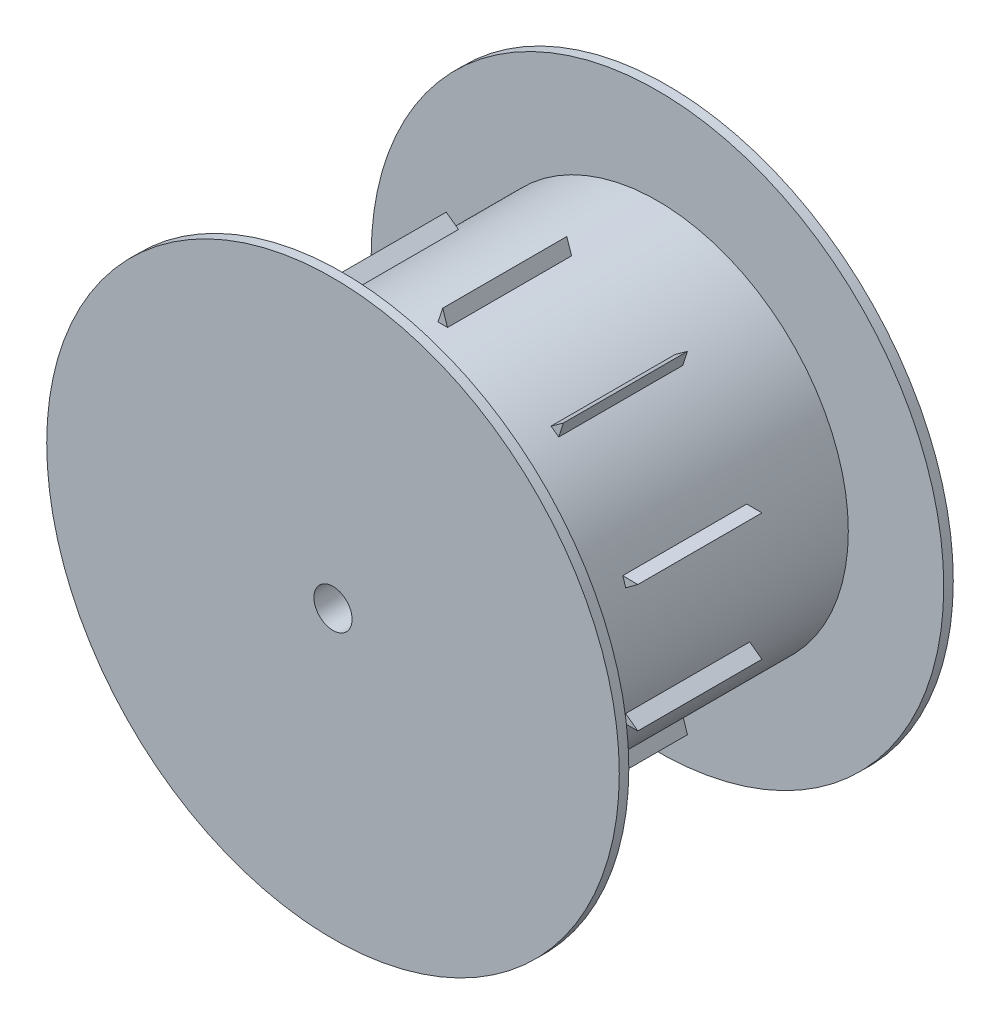
ISO-10303-21;
HEADER;
FILE_DESCRIPTION(('STEP AP214'),'2;1');
FILE_NAME('part.step','',(''),(''),'','','');
FILE_SCHEMA(('AUTOMOTIVE_DESIGN { 1 0 10303 214 1 1 1 1 }'));
ENDSEC;
DATA;
#1=APPLICATION_CONTEXT('core data for automotive mechanical design processes');
#2=APPLICATION_PROTOCOL_DEFINITION('international standard','automotive_design',2000,#1);
#3=PRODUCT_CONTEXT('',#1,'mechanical');
#4=PRODUCT('Part','Part','',(#3));
#5=PRODUCT_RELATED_PRODUCT_CATEGORY('part','',(#4));
#6=PRODUCT_DEFINITION_FORMATION('','',#4);
#7=PRODUCT_DEFINITION_CONTEXT('part definition',#1,'design');
#8=PRODUCT_DEFINITION('design','',#6,#7);
#9=PRODUCT_DEFINITION_SHAPE('','',#8);
#10=(LENGTH_UNIT() NAMED_UNIT(*) SI_UNIT(.MILLI.,.METRE.));
#11=(NAMED_UNIT(*) PLANE_ANGLE_UNIT() SI_UNIT($,.RADIAN.));
#12=(NAMED_UNIT(*) SI_UNIT($,.STERADIAN.) SOLID_ANGLE_UNIT());
#13=UNCERTAINTY_MEASURE_WITH_UNIT(LENGTH_MEASURE(1.E-05),#10,'distance_accuracy_value','');
#14=(GEOMETRIC_REPRESENTATION_CONTEXT(3) GLOBAL_UNCERTAINTY_ASSIGNED_CONTEXT((#13)) GLOBAL_UNIT_ASSIGNED_CONTEXT((#10,
#11,#12)) REPRESENTATION_CONTEXT('',''));
#15=CARTESIAN_POINT('',(0.,0.,0.));
#16=DIRECTION('',(0.,0.,1.));
#17=DIRECTION('',(1.,0.,0.));
#18=AXIS2_PLACEMENT_3D('',#15,#16,#17);
#19=CARTESIAN_POINT('',(-12.2328744271007,17.6877580052076,10.5));
#20=DIRECTION('',(0.,0.,1.));
#21=DIRECTION('',(1.,0.,0.));
#22=AXIS2_PLACEMENT_3D('',#19,#20,#21);
#23=PLANE('',#22);
#24=DIRECTION('',(-0.30297563116742,-0.952998303733382,0.));
#25=VECTOR('',#24,1.);
#26=CARTESIAN_POINT('',(6.45512176317895,-2.05220154411612,10.5));
#27=LINE('',#26,#25);
#28=CARTESIAN_POINT('',(12.6373829242879,17.3938653790615,10.5));
#29=VERTEX_POINT('',#28);
#30=CARTESIAN_POINT('',(12.1565393110214,15.8813901148354,10.5));
#31=VERTEX_POINT('',#30);
#32=EDGE_CURVE('E365',#29,#31,#27,.T.);
#33=ORIENTED_EDGE('',*,*,#32,.T.);
#34=CARTESIAN_POINT('',(0.,0.,10.5));
#35=DIRECTION('',(0.,0.,1.));
#36=DIRECTION('',(1.,0.,0.));
#37=AXIS2_PLACEMENT_3D('',#34,#35,#36);
#38=CIRCLE('',#37,20.);
#39=CARTESIAN_POINT('',(11.3475223166465,16.4691753671278,10.5));
#40=VERTEX_POINT('',#39);
#41=EDGE_CURVE('E590',#31,#40,#38,.T.);
#42=ORIENTED_EDGE('',*,*,#41,.T.);
#43=DIRECTION('',(0.812730627871636,0.582639619764548,0.));
#44=VECTOR('',#43,1.);
#45=CARTESIAN_POINT('',(-3.94650197686461,5.50502046333546,10.5));
#46=LINE('',#45,#44);
#47=EDGE_CURVE('E370',#40,#29,#46,.T.);
#48=ORIENTED_EDGE('',*,*,#47,.T.);
#49=EDGE_LOOP('',(#33,#42,#48));
#50=FACE_BOUND('',#49,.T.);
#51=ADVANCED_FACE('F163',(#50),#23,.F.);
#52=CARTESIAN_POINT('',(-12.2328744271007,17.6877580052076,23.5));
#53=DIRECTION('',(0.,0.,1.));
#54=DIRECTION('',(1.,0.,0.));
#55=AXIS2_PLACEMENT_3D('',#52,#53,#54);
#56=PLANE('',#55);
#57=CARTESIAN_POINT('',(0.,0.,23.5));
#58=DIRECTION('',(0.,0.,1.));
#59=DIRECTION('',(1.,0.,0.));
#60=AXIS2_PLACEMENT_3D('',#57,#58,#59);
#61=CIRCLE('',#60,20.);
#62=CARTESIAN_POINT('',(12.1565393110214,15.8813901148354,23.5));
#63=VERTEX_POINT('',#62);
#64=CARTESIAN_POINT('',(11.3475223166466,16.4691753671278,23.5));
#65=VERTEX_POINT('',#64);
#66=EDGE_CURVE('E377',#63,#65,#61,.T.);
#67=ORIENTED_EDGE('',*,*,#66,.F.);
#68=DIRECTION('',(0.30297563116742,0.952998303733382,0.));
#69=VECTOR('',#68,1.);
#70=CARTESIAN_POINT('',(6.45512176317895,-2.05220154411612,23.5));
#71=LINE('',#70,#69);
#72=CARTESIAN_POINT('',(12.6373829242879,17.3938653790615,23.5));
#73=VERTEX_POINT('',#72);
#74=EDGE_CURVE('E362',#63,#73,#71,.T.);
#75=ORIENTED_EDGE('',*,*,#74,.T.);
#76=DIRECTION('',(-0.812730627871636,-0.582639619764548,0.));
#77=VECTOR('',#76,1.);
#78=CARTESIAN_POINT('',(-3.94650197686461,5.50502046333546,23.5));
#79=LINE('',#78,#77);
#80=EDGE_CURVE('E369',#73,#65,#79,.T.);
#81=ORIENTED_EDGE('',*,*,#80,.T.);
#82=EDGE_LOOP('',(#67,#75,#81));
#83=FACE_BOUND('',#82,.T.);
#84=ADVANCED_FACE('F375',(#83),#56,.T.);
#85=DIRECTION('',(0.99997986569607,-0.00634572316367438,0.));
#86=VECTOR('',#85,1.);
#87=CARTESIAN_POINT('',(0.0429826742990749,6.77335076936435,10.5));
#88=LINE('',#87,#86);
#89=CARTESIAN_POINT('',(18.8606767964322,6.65393648756314,10.5));
#90=VERTEX_POINT('',#89);
#91=CARTESIAN_POINT('',(20.4477151003457,6.6438653790616,10.5));
#92=VERTEX_POINT('',#91);
#93=EDGE_CURVE('E378',#90,#92,#88,.T.);
#94=ORIENTED_EDGE('',*,*,#93,.T.);
#95=DIRECTION('',(-0.805270782890145,-0.59290721552659,0.));
#96=VECTOR('',#95,1.);
#97=CARTESIAN_POINT('',(4.01604940480804,-5.45449129922123,10.5));
#98=LINE('',#97,#96);
#99=CARTESIAN_POINT('',(19.1696937908072,5.70287997126799,10.5));
#100=VERTEX_POINT('',#99);
#101=EDGE_CURVE('E383',#92,#100,#98,.T.);
#102=ORIENTED_EDGE('',*,*,#101,.T.);
#103=EDGE_CURVE('E449',#100,#90,#38,.T.);
#104=ORIENTED_EDGE('',*,*,#103,.T.);
#105=EDGE_LOOP('',(#94,#102,#104));
#106=FACE_BOUND('',#105,.T.);
#107=ADVANCED_FACE('F666',(#106),#23,.F.);
#108=DIRECTION('',(0.805270782890145,0.59290721552659,0.));
#109=VECTOR('',#108,1.);
#110=CARTESIAN_POINT('',(4.01604940480804,-5.45449129922123,23.5));
#111=LINE('',#110,#109);
#112=CARTESIAN_POINT('',(19.1696937908072,5.70287997126799,23.5));
#113=VERTEX_POINT('',#112);
#114=CARTESIAN_POINT('',(20.4477151003457,6.6438653790616,23.5));
#115=VERTEX_POINT('',#114);
#116=EDGE_CURVE('E386',#113,#115,#111,.T.);
#117=ORIENTED_EDGE('',*,*,#116,.T.);
#118=DIRECTION('',(-0.99997986569607,0.00634572316367438,0.));
#119=VECTOR('',#118,1.);
#120=CARTESIAN_POINT('',(0.0429826742990749,6.77335076936435,23.5));
#121=LINE('',#120,#119);
#122=CARTESIAN_POINT('',(18.8606767964322,6.65393648756314,23.5));
#123=VERTEX_POINT('',#122);
#124=EDGE_CURVE('E178',#115,#123,#121,.T.);
#125=ORIENTED_EDGE('',*,*,#124,.T.);
#126=EDGE_CURVE('E454',#113,#123,#61,.T.);
#127=ORIENTED_EDGE('',*,*,#126,.F.);
#128=EDGE_LOOP('',(#117,#125,#127));
#129=FACE_BOUND('',#128,.T.);
#130=ADVANCED_FACE('F577',(#129),#56,.T.);
#131=DIRECTION('',(-0.99997986569607,-0.00634572316369786,0.));
#132=VECTOR('',#131,1.);
#133=CARTESIAN_POINT('',(0.0429826742992345,-6.7733507693644,10.5));
#134=LINE('',#133,#132);
#135=CARTESIAN_POINT('',(20.4477151003459,-6.64386537906117,10.5));
#136=VERTEX_POINT('',#135);
#137=CARTESIAN_POINT('',(18.8606767964323,-6.65393648756275,10.5));
#138=VERTEX_POINT('',#137);
#139=EDGE_CURVE('E718',#136,#138,#134,.T.);
#140=ORIENTED_EDGE('',*,*,#139,.T.);
#141=CARTESIAN_POINT('',(19.1696937908073,-5.7028799712676,10.5));
#142=VERTEX_POINT('',#141);
#143=EDGE_CURVE('E445',#138,#142,#38,.T.);
#144=ORIENTED_EDGE('',*,*,#143,.T.);
#145=DIRECTION('',(0.805270782890159,-0.592907215526571,0.));
#146=VECTOR('',#145,1.);
#147=CARTESIAN_POINT('',(4.01604940480788,5.45449129922129,10.5));
#148=LINE('',#147,#146);
#149=EDGE_CURVE('E438',#142,#136,#148,.T.);
#150=ORIENTED_EDGE('',*,*,#149,.T.);
#151=EDGE_LOOP('',(#140,#144,#150));
#152=FACE_BOUND('',#151,.T.);
#153=ADVANCED_FACE('F674',(#152),#23,.F.);
#154=CARTESIAN_POINT('',(18.8606767964323,-6.65393648756275,23.5));
#155=VERTEX_POINT('',#154);
#156=CARTESIAN_POINT('',(19.1696937908073,-5.7028799712676,23.5));
#157=VERTEX_POINT('',#156);
#158=EDGE_CURVE('E450',#155,#157,#61,.T.);
#159=ORIENTED_EDGE('',*,*,#158,.F.);
#160=DIRECTION('',(0.99997986569607,0.00634572316369786,0.));
#161=VECTOR('',#160,1.);
#162=CARTESIAN_POINT('',(0.0429826742992345,-6.7733507693644,23.5));
#163=LINE('',#162,#161);
#164=CARTESIAN_POINT('',(20.4477151003459,-6.64386537906117,23.5));
#165=VERTEX_POINT('',#164);
#166=EDGE_CURVE('E635',#155,#165,#163,.T.);
#167=ORIENTED_EDGE('',*,*,#166,.T.);
#168=DIRECTION('',(-0.805270782890159,0.592907215526571,0.));
#169=VECTOR('',#168,1.);
#170=CARTESIAN_POINT('',(4.01604940480788,5.45449129922129,23.5));
#171=LINE('',#170,#169);
#172=EDGE_CURVE('E434',#165,#157,#171,.T.);
#173=ORIENTED_EDGE('',*,*,#172,.T.);
#174=EDGE_LOOP('',(#159,#167,#173));
#175=FACE_BOUND('',#174,.T.);
#176=ADVANCED_FACE('F706',(#175),#56,.T.);
#177=DIRECTION('',(0.302975631167443,-0.952998303733375,0.));
#178=VECTOR('',#177,1.);
#179=CARTESIAN_POINT('',(6.45512176317885,2.05220154411626,10.5));
#180=LINE('',#179,#178);
#181=CARTESIAN_POINT('',(12.1565393110218,-15.8813901148351,10.5));
#182=VERTEX_POINT('',#181);
#183=CARTESIAN_POINT('',(12.6373829242883,-17.3938653790613,10.5));
#184=VERTEX_POINT('',#183);
#185=EDGE_CURVE('E617',#182,#184,#180,.T.);
#186=ORIENTED_EDGE('',*,*,#185,.T.);
#187=DIRECTION('',(-0.81273062787165,0.582639619764528,0.));
#188=VECTOR('',#187,1.);
#189=CARTESIAN_POINT('',(-3.94650197686451,-5.5050204633356,10.5));
#190=LINE('',#189,#188);
#191=CARTESIAN_POINT('',(11.3475223166468,-16.4691753671276,10.5));
#192=VERTEX_POINT('',#191);
#193=EDGE_CURVE('E431',#184,#192,#190,.T.);
#194=ORIENTED_EDGE('',*,*,#193,.T.);
#195=EDGE_CURVE('E448',#192,#182,#38,.T.);
#196=ORIENTED_EDGE('',*,*,#195,.T.);
#197=EDGE_LOOP('',(#186,#194,#196));
#198=FACE_BOUND('',#197,.T.);
#199=ADVANCED_FACE('F616',(#198),#23,.F.);
#200=DIRECTION('',(0.81273062787165,-0.582639619764528,0.));
#201=VECTOR('',#200,1.);
#202=CARTESIAN_POINT('',(-3.94650197686451,-5.5050204633356,23.5));
#203=LINE('',#202,#201);
#204=CARTESIAN_POINT('',(11.3475223166468,-16.4691753671276,23.5));
#205=VERTEX_POINT('',#204);
#206=CARTESIAN_POINT('',(12.6373829242883,-17.3938653790613,23.5));
#207=VERTEX_POINT('',#206);
#208=EDGE_CURVE('E427',#205,#207,#203,.T.);
#209=ORIENTED_EDGE('',*,*,#208,.T.);
#210=DIRECTION('',(-0.302975631167443,0.952998303733375,0.));
#211=VECTOR('',#210,1.);
#212=CARTESIAN_POINT('',(6.45512176317885,2.05220154411626,23.5));
#213=LINE('',#212,#211);
#214=CARTESIAN_POINT('',(12.1565393110218,-15.8813901148351,23.5));
#215=VERTEX_POINT('',#214);
#216=EDGE_CURVE('E186',#207,#215,#213,.T.);
#217=ORIENTED_EDGE('',*,*,#216,.T.);
#218=EDGE_CURVE('E453',#205,#215,#61,.T.);
#219=ORIENTED_EDGE('',*,*,#218,.F.);
#220=EDGE_LOOP('',(#209,#217,#219));
#221=FACE_BOUND('',#220,.T.);
#222=ADVANCED_FACE('F626',(#221),#56,.T.);
#223=DIRECTION('',(-0.315045913898294,0.949076431135021,0.));
#224=VECTOR('',#223,1.);
#225=CARTESIAN_POINT('',(-6.42855700953468,-2.13395944907624,10.5));
#226=LINE('',#225,#224);
#227=CARTESIAN_POINT('',(0.,-21.5,10.5));
#228=VERTEX_POINT('',#227);
#229=CARTESIAN_POINT('',(-0.500000000000002,-19.9937490231322,10.5));
#230=VERTEX_POINT('',#229);
#231=EDGE_CURVE('E627',#228,#230,#226,.T.);
#232=ORIENTED_EDGE('',*,*,#231,.T.);
#233=CARTESIAN_POINT('',(0.499999999999998,-19.9937490231322,10.5));
#234=VERTEX_POINT('',#233);
#235=EDGE_CURVE('E604',#230,#234,#38,.T.);
#236=ORIENTED_EDGE('',*,*,#235,.T.);
#237=DIRECTION('',(-0.315045913898292,-0.949076431135022,0.));
#238=VECTOR('',#237,1.);
#239=CARTESIAN_POINT('',(6.42855700953463,-2.13395944907621,10.5));
#240=LINE('',#239,#238);
#241=EDGE_CURVE('E424',#234,#228,#240,.T.);
#242=ORIENTED_EDGE('',*,*,#241,.T.);
#243=EDGE_LOOP('',(#232,#236,#242));
#244=FACE_BOUND('',#243,.T.);
#245=ADVANCED_FACE('F697',(#244),#23,.F.);
#246=CARTESIAN_POINT('',(-0.500000000000002,-19.9937490231322,23.5));
#247=VERTEX_POINT('',#246);
#248=CARTESIAN_POINT('',(0.499999999999998,-19.9937490231322,23.5));
#249=VERTEX_POINT('',#248);
#250=EDGE_CURVE('E738',#247,#249,#61,.T.);
#251=ORIENTED_EDGE('',*,*,#250,.F.);
#252=DIRECTION('',(0.315045913898294,-0.949076431135021,0.));
#253=VECTOR('',#252,1.);
#254=CARTESIAN_POINT('',(-6.42855700953468,-2.13395944907624,23.5));
#255=LINE('',#254,#253);
#256=CARTESIAN_POINT('',(0.,-21.5,23.5));
#257=VERTEX_POINT('',#256);
#258=EDGE_CURVE('E630',#247,#257,#255,.T.);
#259=ORIENTED_EDGE('',*,*,#258,.T.);
#260=DIRECTION('',(0.315045913898292,0.949076431135022,0.));
#261=VECTOR('',#260,1.);
#262=CARTESIAN_POINT('',(6.42855700953463,-2.13395944907621,23.5));
#263=LINE('',#262,#261);
#264=EDGE_CURVE('E420',#257,#249,#263,.T.);
#265=ORIENTED_EDGE('',*,*,#264,.T.);
#266=EDGE_LOOP('',(#251,#259,#265));
#267=FACE_BOUND('',#266,.T.);
#268=ADVANCED_FACE('F695',(#267),#56,.T.);
#269=DIRECTION('',(-0.81273062787164,-0.582639619764542,0.));
#270=VECTOR('',#269,1.);
#271=CARTESIAN_POINT('',(3.94650197686457,-5.50502046333549,10.5));
#272=LINE('',#271,#270);
#273=CARTESIAN_POINT('',(-11.3475223166466,-16.4691753671278,10.5));
#274=VERTEX_POINT('',#273);
#275=CARTESIAN_POINT('',(-12.6373829242881,-17.3938653790614,10.5));
#276=VERTEX_POINT('',#275);
#277=EDGE_CURVE('E642',#274,#276,#272,.T.);
#278=ORIENTED_EDGE('',*,*,#277,.T.);
#279=DIRECTION('',(0.302975631167427,0.95299830373338,0.));
#280=VECTOR('',#279,1.);
#281=CARTESIAN_POINT('',(-6.45512176317894,2.05220154411617,10.5));
#282=LINE('',#281,#280);
#283=CARTESIAN_POINT('',(-12.1565393110215,-15.8813901148353,10.5));
#284=VERTEX_POINT('',#283);
#285=EDGE_CURVE('E417',#276,#284,#282,.T.);
#286=ORIENTED_EDGE('',*,*,#285,.T.);
#287=EDGE_CURVE('E599',#284,#274,#38,.T.);
#288=ORIENTED_EDGE('',*,*,#287,.T.);
#289=EDGE_LOOP('',(#278,#286,#288));
#290=FACE_BOUND('',#289,.T.);
#291=ADVANCED_FACE('F690',(#290),#23,.F.);
#292=DIRECTION('',(-0.302975631167427,-0.95299830373338,0.));
#293=VECTOR('',#292,1.);
#294=CARTESIAN_POINT('',(-6.45512176317894,2.05220154411617,23.5));
#295=LINE('',#294,#293);
#296=CARTESIAN_POINT('',(-12.1565393110215,-15.8813901148353,23.5));
#297=VERTEX_POINT('',#296);
#298=CARTESIAN_POINT('',(-12.6373829242881,-17.3938653790614,23.5));
#299=VERTEX_POINT('',#298);
#300=EDGE_CURVE('E413',#297,#299,#295,.T.);
#301=ORIENTED_EDGE('',*,*,#300,.T.);
#302=DIRECTION('',(0.81273062787164,0.582639619764542,0.));
#303=VECTOR('',#302,1.);
#304=CARTESIAN_POINT('',(3.94650197686457,-5.50502046333549,23.5));
#305=LINE('',#304,#303);
#306=CARTESIAN_POINT('',(-11.3475223166466,-16.4691753671278,23.5));
#307=VERTEX_POINT('',#306);
#308=EDGE_CURVE('E638',#299,#307,#305,.T.);
#309=ORIENTED_EDGE('',*,*,#308,.T.);
#310=EDGE_CURVE('E745',#297,#307,#61,.T.);
#311=ORIENTED_EDGE('',*,*,#310,.F.);
#312=EDGE_LOOP('',(#301,#309,#311));
#313=FACE_BOUND('',#312,.T.);
#314=ADVANCED_FACE('F688',(#313),#56,.T.);
#315=DIRECTION('',(0.805270782890149,0.592907215526584,0.));
#316=VECTOR('',#315,1.);
#317=CARTESIAN_POINT('',(-4.01604940480801,5.45449129922126,10.5));
#318=LINE('',#317,#316);
#319=CARTESIAN_POINT('',(-20.4477151003458,-6.64386537906146,10.5));
#320=VERTEX_POINT('',#319);
#321=CARTESIAN_POINT('',(-19.1696937908072,-5.70287997126786,10.5));
#322=VERTEX_POINT('',#321);
#323=EDGE_CURVE('E570',#320,#322,#318,.T.);
#324=ORIENTED_EDGE('',*,*,#323,.T.);
#325=CARTESIAN_POINT('',(-18.8606767964322,-6.65393648756301,10.5));
#326=VERTEX_POINT('',#325);
#327=EDGE_CURVE('E597',#322,#326,#38,.T.);
#328=ORIENTED_EDGE('',*,*,#327,.T.);
#329=DIRECTION('',(-0.99997986569607,0.00634572316368137,0.));
#330=VECTOR('',#329,1.);
#331=CARTESIAN_POINT('',(-0.0429826742991226,-6.77335076936435,10.5));
#332=LINE('',#331,#330);
#333=EDGE_CURVE('E410',#326,#320,#332,.T.);
#334=ORIENTED_EDGE('',*,*,#333,.T.);
#335=EDGE_LOOP('',(#324,#328,#334));
#336=FACE_BOUND('',#335,.T.);
#337=ADVANCED_FACE('F682',(#336),#23,.F.);
#338=CARTESIAN_POINT('',(-19.1696937908072,-5.70287997126786,23.5));
#339=VERTEX_POINT('',#338);
#340=CARTESIAN_POINT('',(-18.8606767964322,-6.65393648756301,23.5));
#341=VERTEX_POINT('',#340);
#342=EDGE_CURVE('E747',#339,#341,#61,.T.);
#343=ORIENTED_EDGE('',*,*,#342,.F.);
#344=DIRECTION('',(-0.805270782890149,-0.592907215526584,0.));
#345=VECTOR('',#344,1.);
#346=CARTESIAN_POINT('',(-4.01604940480801,5.45449129922126,23.5));
#347=LINE('',#346,#345);
#348=CARTESIAN_POINT('',(-20.4477151003458,-6.64386537906146,23.5));
#349=VERTEX_POINT('',#348);
#350=EDGE_CURVE('E565',#339,#349,#347,.T.);
#351=ORIENTED_EDGE('',*,*,#350,.T.);
#352=DIRECTION('',(0.99997986569607,-0.00634572316368137,0.));
#353=VECTOR('',#352,1.);
#354=CARTESIAN_POINT('',(-0.0429826742991226,-6.77335076936435,23.5));
#355=LINE('',#354,#353);
#356=EDGE_CURVE('E406',#349,#341,#355,.T.);
#357=ORIENTED_EDGE('',*,*,#356,.T.);
#358=EDGE_LOOP('',(#343,#351,#357));
#359=FACE_BOUND('',#358,.T.);
#360=ADVANCED_FACE('F681',(#359),#56,.T.);
#361=DIRECTION('',(-0.805270782890154,0.592907215526576,0.));
#362=VECTOR('',#361,1.);
#363=CARTESIAN_POINT('',(-4.01604940480792,-5.45449129922126,10.5));
#364=LINE('',#363,#362);
#365=CARTESIAN_POINT('',(-19.1696937908072,5.70287997126773,10.5));
#366=VERTEX_POINT('',#365);
#367=CARTESIAN_POINT('',(-20.4477151003458,6.64386537906131,10.5));
#368=VERTEX_POINT('',#367);
#369=EDGE_CURVE('E562',#366,#368,#364,.T.);
#370=ORIENTED_EDGE('',*,*,#369,.T.);
#371=DIRECTION('',(0.99997986569607,0.00634572316369114,0.));
#372=VECTOR('',#371,1.);
#373=CARTESIAN_POINT('',(-0.042982674299189,6.7733507693644,10.5));
#374=LINE('',#373,#372);
#375=CARTESIAN_POINT('',(-18.8606767964323,6.65393648756288,10.5));
#376=VERTEX_POINT('',#375);
#377=EDGE_CURVE('E403',#368,#376,#374,.T.);
#378=ORIENTED_EDGE('',*,*,#377,.T.);
#379=EDGE_CURVE('E554',#376,#366,#38,.T.);
#380=ORIENTED_EDGE('',*,*,#379,.T.);
#381=EDGE_LOOP('',(#370,#378,#380));
#382=FACE_BOUND('',#381,.T.);
#383=ADVANCED_FACE('F561',(#382),#23,.F.);
#384=DIRECTION('',(-0.99997986569607,-0.00634572316369114,0.));
#385=VECTOR('',#384,1.);
#386=CARTESIAN_POINT('',(-0.042982674299189,6.7733507693644,23.5));
#387=LINE('',#386,#385);
#388=CARTESIAN_POINT('',(-18.8606767964323,6.65393648756288,23.5));
#389=VERTEX_POINT('',#388);
#390=CARTESIAN_POINT('',(-20.4477151003458,6.64386537906131,23.5));
#391=VERTEX_POINT('',#390);
#392=EDGE_CURVE('E399',#389,#391,#387,.T.);
#393=ORIENTED_EDGE('',*,*,#392,.T.);
#394=DIRECTION('',(0.805270782890155,-0.592907215526576,0.));
#395=VECTOR('',#394,1.);
#396=CARTESIAN_POINT('',(-4.01604940480792,-5.45449129922126,23.5));
#397=LINE('',#396,#395);
#398=CARTESIAN_POINT('',(-19.1696937908072,5.70287997126773,23.5));
#399=VERTEX_POINT('',#398);
#400=EDGE_CURVE('E567',#391,#399,#397,.T.);
#401=ORIENTED_EDGE('',*,*,#400,.T.);
#402=EDGE_CURVE('E552',#389,#399,#61,.T.);
#403=ORIENTED_EDGE('',*,*,#402,.F.);
#404=EDGE_LOOP('',(#393,#401,#403));
#405=FACE_BOUND('',#404,.T.);
#406=ADVANCED_FACE('F650',(#405),#56,.T.);
#407=CARTESIAN_POINT('',(-11.3475223166467,16.4691753671277,23.5));
#408=VERTEX_POINT('',#407);
#409=CARTESIAN_POINT('',(-12.1565393110216,15.8813901148352,23.5));
#410=VERTEX_POINT('',#409);
#411=EDGE_CURVE('E755',#408,#410,#61,.T.);
#412=ORIENTED_EDGE('',*,*,#411,.F.);
#413=DIRECTION('',(-0.812730627871646,0.582639619764534,0.));
#414=VECTOR('',#413,1.);
#415=CARTESIAN_POINT('',(3.94650197686455,5.50502046333557,23.5));
#416=LINE('',#415,#414);
#417=CARTESIAN_POINT('',(-12.6373829242882,17.3938653790614,23.5));
#418=VERTEX_POINT('',#417);
#419=EDGE_CURVE('E390',#408,#418,#416,.T.);
#420=ORIENTED_EDGE('',*,*,#419,.T.);
#421=DIRECTION('',(0.302975631167436,-0.952998303733377,0.));
#422=VECTOR('',#421,1.);
#423=CARTESIAN_POINT('',(-6.45512176317887,-2.05220154411622,23.5));
#424=LINE('',#423,#422);
#425=EDGE_CURVE('E392',#418,#410,#424,.T.);
#426=ORIENTED_EDGE('',*,*,#425,.T.);
#427=EDGE_LOOP('',(#412,#420,#426));
#428=FACE_BOUND('',#427,.T.);
#429=ADVANCED_FACE('F671',(#428),#56,.T.);
#430=DIRECTION('',(0.812730627871646,-0.582639619764534,0.));
#431=VECTOR('',#430,1.);
#432=CARTESIAN_POINT('',(3.94650197686455,5.50502046333557,10.5));
#433=LINE('',#432,#431);
#434=CARTESIAN_POINT('',(-12.6373829242882,17.3938653790614,10.5));
#435=VERTEX_POINT('',#434);
#436=CARTESIAN_POINT('',(-11.3475223166467,16.4691753671277,10.5));
#437=VERTEX_POINT('',#436);
#438=EDGE_CURVE('E647',#435,#437,#433,.T.);
#439=ORIENTED_EDGE('',*,*,#438,.T.);
#440=CARTESIAN_POINT('',(-12.1565393110216,15.8813901148352,10.5));
#441=VERTEX_POINT('',#440);
#442=EDGE_CURVE('E591',#437,#441,#38,.T.);
#443=ORIENTED_EDGE('',*,*,#442,.T.);
#444=DIRECTION('',(-0.302975631167436,0.952998303733377,0.));
#445=VECTOR('',#444,1.);
#446=CARTESIAN_POINT('',(-6.45512176317887,-2.05220154411622,10.5));
#447=LINE('',#446,#445);
#448=EDGE_CURVE('E396',#441,#435,#447,.T.);
#449=ORIENTED_EDGE('',*,*,#448,.T.);
#450=EDGE_LOOP('',(#439,#443,#449));
#451=FACE_BOUND('',#450,.T.);
#452=ADVANCED_FACE('F540',(#451),#23,.F.);
#453=CARTESIAN_POINT('',(0.,0.,35.));
#454=DIRECTION('',(0.,0.,-1.));
#455=DIRECTION('',(-1.,0.,0.));
#456=AXIS2_PLACEMENT_3D('',#453,#454,#455);
#457=CYLINDRICAL_SURFACE('',#456,20.);
#458=DIRECTION('',(0.,0.,-1.));
#459=VECTOR('',#458,1.);
#460=CARTESIAN_POINT('',(-11.3475223166467,16.4691753671277,35.));
#461=LINE('',#460,#459);
#462=EDGE_CURVE('E443',#408,#437,#461,.T.);
#463=ORIENTED_EDGE('',*,*,#462,.F.);
#464=ORIENTED_EDGE('',*,*,#411,.T.);
#465=DIRECTION('',(0.,0.,-1.));
#466=VECTOR('',#465,1.);
#467=CARTESIAN_POINT('',(-12.1565393110216,15.8813901148352,35.));
#468=LINE('',#467,#466);
#469=EDGE_CURVE('E482',#410,#441,#468,.T.);
#470=ORIENTED_EDGE('',*,*,#469,.T.);
#471=ORIENTED_EDGE('',*,*,#442,.F.);
#472=EDGE_LOOP('',(#463,#464,#470,#471));
#473=FACE_BOUND('',#472,.T.);
#474=DIRECTION('',(0.,0.,-1.));
#475=VECTOR('',#474,1.);
#476=CARTESIAN_POINT('',(-19.1696937908072,-5.70287997126786,35.));
#477=LINE('',#476,#475);
#478=EDGE_CURVE('E488',#339,#322,#477,.T.);
#479=ORIENTED_EDGE('',*,*,#478,.F.);
#480=ORIENTED_EDGE('',*,*,#342,.T.);
#481=DIRECTION('',(0.,0.,-1.));
#482=VECTOR('',#481,1.);
#483=CARTESIAN_POINT('',(-18.8606767964322,-6.65393648756301,35.));
#484=LINE('',#483,#482);
#485=EDGE_CURVE('E485',#341,#326,#484,.T.);
#486=ORIENTED_EDGE('',*,*,#485,.T.);
#487=ORIENTED_EDGE('',*,*,#327,.F.);
#488=EDGE_LOOP('',(#479,#480,#486,#487));
#489=FACE_BOUND('',#488,.T.);
#490=ORIENTED_EDGE('',*,*,#310,.T.);
#491=DIRECTION('',(0.,0.,-1.));
#492=VECTOR('',#491,1.);
#493=CARTESIAN_POINT('',(-11.3475223166466,-16.4691753671278,35.));
#494=LINE('',#493,#492);
#495=EDGE_CURVE('E467',#307,#274,#494,.T.);
#496=ORIENTED_EDGE('',*,*,#495,.T.);
#497=ORIENTED_EDGE('',*,*,#287,.F.);
#498=DIRECTION('',(0.,0.,-1.));
#499=VECTOR('',#498,1.);
#500=CARTESIAN_POINT('',(-12.1565393110215,-15.8813901148353,35.));
#501=LINE('',#500,#499);
#502=EDGE_CURVE('E465',#297,#284,#501,.T.);
#503=ORIENTED_EDGE('',*,*,#502,.F.);
#504=EDGE_LOOP('',(#490,#496,#497,#503));
#505=FACE_BOUND('',#504,.T.);
#506=ORIENTED_EDGE('',*,*,#250,.T.);
#507=DIRECTION('',(0.,0.,-1.));
#508=VECTOR('',#507,1.);
#509=CARTESIAN_POINT('',(0.499999999999998,-19.9937490231322,35.));
#510=LINE('',#509,#508);
#511=EDGE_CURVE('E462',#249,#234,#510,.T.);
#512=ORIENTED_EDGE('',*,*,#511,.T.);
#513=ORIENTED_EDGE('',*,*,#235,.F.);
#514=DIRECTION('',(0.,0.,-1.));
#515=VECTOR('',#514,1.);
#516=CARTESIAN_POINT('',(-0.500000000000002,-19.9937490231322,35.));
#517=LINE('',#516,#515);
#518=EDGE_CURVE('E460',#247,#230,#517,.T.);
#519=ORIENTED_EDGE('',*,*,#518,.F.);
#520=EDGE_LOOP('',(#506,#512,#513,#519));
#521=FACE_BOUND('',#520,.T.);
#522=ORIENTED_EDGE('',*,*,#218,.T.);
#523=DIRECTION('',(0.,0.,-1.));
#524=VECTOR('',#523,1.);
#525=CARTESIAN_POINT('',(12.1565393110218,-15.8813901148351,35.));
#526=LINE('',#525,#524);
#527=EDGE_CURVE('E457',#215,#182,#526,.T.);
#528=ORIENTED_EDGE('',*,*,#527,.T.);
#529=ORIENTED_EDGE('',*,*,#195,.F.);
#530=DIRECTION('',(0.,0.,-1.));
#531=VECTOR('',#530,1.);
#532=CARTESIAN_POINT('',(11.3475223166468,-16.4691753671276,35.));
#533=LINE('',#532,#531);
#534=EDGE_CURVE('E455',#205,#192,#533,.T.);
#535=ORIENTED_EDGE('',*,*,#534,.F.);
#536=EDGE_LOOP('',(#522,#528,#529,#535));
#537=FACE_BOUND('',#536,.T.);
#538=ORIENTED_EDGE('',*,*,#158,.T.);
#539=DIRECTION('',(0.,0.,-1.));
#540=VECTOR('',#539,1.);
#541=CARTESIAN_POINT('',(19.1696937908073,-5.70287997126759,35.));
#542=LINE('',#541,#540);
#543=EDGE_CURVE('E477',#157,#142,#542,.T.);
#544=ORIENTED_EDGE('',*,*,#543,.T.);
#545=ORIENTED_EDGE('',*,*,#143,.F.);
#546=DIRECTION('',(0.,0.,-1.));
#547=VECTOR('',#546,1.);
#548=CARTESIAN_POINT('',(18.8606767964323,-6.65393648756275,35.));
#549=LINE('',#548,#547);
#550=EDGE_CURVE('E475',#155,#138,#549,.T.);
#551=ORIENTED_EDGE('',*,*,#550,.F.);
#552=EDGE_LOOP('',(#538,#544,#545,#551));
#553=FACE_BOUND('',#552,.T.);
#554=ORIENTED_EDGE('',*,*,#126,.T.);
#555=DIRECTION('',(0.,0.,-1.));
#556=VECTOR('',#555,1.);
#557=CARTESIAN_POINT('',(18.8606767964322,6.65393648756314,35.));
#558=LINE('',#557,#556);
#559=EDGE_CURVE('E472',#123,#90,#558,.T.);
#560=ORIENTED_EDGE('',*,*,#559,.T.);
#561=ORIENTED_EDGE('',*,*,#103,.F.);
#562=DIRECTION('',(0.,0.,-1.));
#563=VECTOR('',#562,1.);
#564=CARTESIAN_POINT('',(19.1696937908072,5.70287997126799,35.));
#565=LINE('',#564,#563);
#566=EDGE_CURVE('E470',#113,#100,#565,.T.);
#567=ORIENTED_EDGE('',*,*,#566,.F.);
#568=EDGE_LOOP('',(#554,#560,#561,#567));
#569=FACE_BOUND('',#568,.T.);
#570=CARTESIAN_POINT('',(0.,0.,1.));
#571=DIRECTION('',(0.,0.,-1.));
#572=DIRECTION('',(-1.,0.,0.));
#573=AXIS2_PLACEMENT_3D('',#570,#571,#572);
#574=CIRCLE('',#573,20.);
#575=CARTESIAN_POINT('',(-20.,0.,1.));
#576=VERTEX_POINT('',#575);
#577=EDGE_CURVE('E12',#576,#576,#574,.T.);
#578=ORIENTED_EDGE('',*,*,#577,.F.);
#579=EDGE_LOOP('',(#578));
#580=FACE_BOUND('',#579,.T.);
#581=CARTESIAN_POINT('',(0.,0.,34.));
#582=DIRECTION('',(0.,0.,1.));
#583=DIRECTION('',(1.,0.,0.));
#584=AXIS2_PLACEMENT_3D('',#581,#582,#583);
#585=CIRCLE('',#584,20.);
#586=CARTESIAN_POINT('',(20.,0.,34.));
#587=VERTEX_POINT('',#586);
#588=EDGE_CURVE('E171',#587,#587,#585,.T.);
#589=ORIENTED_EDGE('',*,*,#588,.F.);
#590=EDGE_LOOP('',(#589));
#591=FACE_BOUND('',#590,.T.);
#592=DIRECTION('',(0.,0.,-1.));
#593=VECTOR('',#592,1.);
#594=CARTESIAN_POINT('',(0.500000000000002,19.9937490231322,35.));
#595=LINE('',#594,#593);
#596=CARTESIAN_POINT('',(0.500000000000002,19.9937490231322,23.5));
#597=VERTEX_POINT('',#596);
#598=CARTESIAN_POINT('',(0.500000000000002,19.9937490231322,10.5));
#599=VERTEX_POINT('',#598);
#600=EDGE_CURVE('E515',#597,#599,#595,.T.);
#601=ORIENTED_EDGE('',*,*,#600,.F.);
#602=CARTESIAN_POINT('',(0.,0.,23.5));
#603=DIRECTION('',(0.,0.,1.));
#604=DIRECTION('',(1.,0.,0.));
#605=AXIS2_PLACEMENT_3D('',#602,#603,#604);
#606=CIRCLE('',#605,20.);
#607=CARTESIAN_POINT('',(-0.499999999999998,19.9937490231322,23.5));
#608=VERTEX_POINT('',#607);
#609=EDGE_CURVE('E517',#597,#608,#606,.T.);
#610=ORIENTED_EDGE('',*,*,#609,.T.);
#611=DIRECTION('',(0.,0.,-1.));
#612=VECTOR('',#611,1.);
#613=CARTESIAN_POINT('',(-0.499999999999998,19.9937490231322,35.));
#614=LINE('',#613,#612);
#615=CARTESIAN_POINT('',(-0.499999999999998,19.9937490231322,10.5));
#616=VERTEX_POINT('',#615);
#617=EDGE_CURVE('E505',#608,#616,#614,.T.);
#618=ORIENTED_EDGE('',*,*,#617,.T.);
#619=CARTESIAN_POINT('',(0.,0.,10.5));
#620=DIRECTION('',(0.,0.,1.));
#621=DIRECTION('',(1.,0.,0.));
#622=AXIS2_PLACEMENT_3D('',#619,#620,#621);
#623=CIRCLE('',#622,20.);
#624=EDGE_CURVE('E512',#599,#616,#623,.T.);
#625=ORIENTED_EDGE('',*,*,#624,.F.);
#626=EDGE_LOOP('',(#601,#610,#618,#625));
#627=FACE_BOUND('',#626,.T.);
#628=DIRECTION('',(0.,0.,-1.));
#629=VECTOR('',#628,1.);
#630=CARTESIAN_POINT('',(11.3475223166466,16.4691753671278,35.));
#631=LINE('',#630,#629);
#632=EDGE_CURVE('E382',#40,#65,#631,.F.);
#633=ORIENTED_EDGE('',*,*,#632,.F.);
#634=ORIENTED_EDGE('',*,*,#41,.F.);
#635=DIRECTION('',(0.,0.,-1.));
#636=VECTOR('',#635,1.);
#637=CARTESIAN_POINT('',(12.1565393110214,15.8813901148354,35.));
#638=LINE('',#637,#636);
#639=EDGE_CURVE('E480',#63,#31,#638,.T.);
#640=ORIENTED_EDGE('',*,*,#639,.F.);
#641=ORIENTED_EDGE('',*,*,#66,.T.);
#642=EDGE_LOOP('',(#633,#634,#640,#641));
#643=FACE_BOUND('',#642,.T.);
#644=DIRECTION('',(0.,0.,-1.));
#645=VECTOR('',#644,1.);
#646=CARTESIAN_POINT('',(-18.8606767964323,6.65393648756288,35.));
#647=LINE('',#646,#645);
#648=EDGE_CURVE('E493',#389,#376,#647,.T.);
#649=ORIENTED_EDGE('',*,*,#648,.F.);
#650=ORIENTED_EDGE('',*,*,#402,.T.);
#651=DIRECTION('',(0.,0.,-1.));
#652=VECTOR('',#651,1.);
#653=CARTESIAN_POINT('',(-19.1696937908072,5.70287997126773,35.));
#654=LINE('',#653,#652);
#655=EDGE_CURVE('E490',#399,#366,#654,.T.);
#656=ORIENTED_EDGE('',*,*,#655,.T.);
#657=ORIENTED_EDGE('',*,*,#379,.F.);
#658=EDGE_LOOP('',(#649,#650,#656,#657));
#659=FACE_BOUND('',#658,.T.);
#660=ADVANCED_FACE('F165',(#473,#489,#505,#521,#537,#553,#569,#580,#591,#627,#643,#659),#457,.T.);
#661=CARTESIAN_POINT('',(0.500000000000002,21.5,23.5));
#662=DIRECTION('',(0.,0.,1.));
#663=DIRECTION('',(1.,0.,0.));
#664=AXIS2_PLACEMENT_3D('',#661,#662,#663);
#665=PLANE('',#664);
#666=ORIENTED_EDGE('',*,*,#609,.F.);
#667=DIRECTION('',(-0.315045913898294,0.949076431135021,0.));
#668=VECTOR('',#667,1.);
#669=CARTESIAN_POINT('',(6.42855700953468,2.13395944907624,23.5));
#670=LINE('',#669,#668);
#671=CARTESIAN_POINT('',(0.,21.5,23.5));
#672=VERTEX_POINT('',#671);
#673=EDGE_CURVE('E496',#597,#672,#670,.T.);
#674=ORIENTED_EDGE('',*,*,#673,.T.);
#675=DIRECTION('',(-0.315045913898292,-0.949076431135022,0.));
#676=VECTOR('',#675,1.);
#677=CARTESIAN_POINT('',(-6.42855700953463,2.13395944907621,23.5));
#678=LINE('',#677,#676);
#679=EDGE_CURVE('E502',#672,#608,#678,.T.);
#680=ORIENTED_EDGE('',*,*,#679,.T.);
#681=EDGE_LOOP('',(#666,#674,#680));
#682=FACE_BOUND('',#681,.T.);
#683=ADVANCED_FACE('F539',(#682),#665,.T.);
#684=CARTESIAN_POINT('',(0.500000000000002,21.5,10.5));
#685=DIRECTION('',(0.,0.,1.));
#686=DIRECTION('',(1.,0.,0.));
#687=AXIS2_PLACEMENT_3D('',#684,#685,#686);
#688=PLANE('',#687);
#689=DIRECTION('',(0.315045913898294,-0.949076431135021,0.));
#690=VECTOR('',#689,1.);
#691=CARTESIAN_POINT('',(6.42855700953468,2.13395944907624,10.5));
#692=LINE('',#691,#690);
#693=CARTESIAN_POINT('',(0.,21.5,10.5));
#694=VERTEX_POINT('',#693);
#695=EDGE_CURVE('E495',#694,#599,#692,.T.);
#696=ORIENTED_EDGE('',*,*,#695,.T.);
#697=ORIENTED_EDGE('',*,*,#624,.T.);
#698=DIRECTION('',(0.315045913898292,0.949076431135022,0.));
#699=VECTOR('',#698,1.);
#700=CARTESIAN_POINT('',(-6.42855700953463,2.13395944907621,10.5));
#701=LINE('',#700,#699);
#702=EDGE_CURVE('E499',#616,#694,#701,.T.);
#703=ORIENTED_EDGE('',*,*,#702,.T.);
#704=EDGE_LOOP('',(#696,#697,#703));
#705=FACE_BOUND('',#704,.T.);
#706=ADVANCED_FACE('F780',(#705),#688,.F.);
#707=CARTESIAN_POINT('',(0.,0.,34.));
#708=DIRECTION('',(0.,0.,1.));
#709=DIRECTION('',(1.,0.,0.));
#710=AXIS2_PLACEMENT_3D('',#707,#708,#709);
#711=CYLINDRICAL_SURFACE('',#710,30.);
#712=CARTESIAN_POINT('',(0.,0.,34.));
#713=DIRECTION('',(0.,0.,1.));
#714=DIRECTION('',(1.,0.,0.));
#715=AXIS2_PLACEMENT_3D('',#712,#713,#714);
#716=CIRCLE('',#715,30.);
#717=CARTESIAN_POINT('',(30.,0.,34.));
#718=VERTEX_POINT('',#717);
#719=EDGE_CURVE('E527',#718,#718,#716,.T.);
#720=ORIENTED_EDGE('',*,*,#719,.T.);
#721=EDGE_LOOP('',(#720));
#722=FACE_BOUND('',#721,.T.);
#723=CARTESIAN_POINT('',(0.,0.,35.));
#724=DIRECTION('',(0.,0.,1.));
#725=DIRECTION('',(1.,0.,0.));
#726=AXIS2_PLACEMENT_3D('',#723,#724,#725);
#727=CIRCLE('',#726,30.);
#728=CARTESIAN_POINT('',(30.,0.,35.));
#729=VERTEX_POINT('',#728);
#730=EDGE_CURVE('E524',#729,#729,#727,.T.);
#731=ORIENTED_EDGE('',*,*,#730,.F.);
#732=EDGE_LOOP('',(#731));
#733=FACE_BOUND('',#732,.T.);
#734=ADVANCED_FACE('F778',(#722,#733),#711,.T.);
#735=CARTESIAN_POINT('',(0.,0.,34.));
#736=DIRECTION('',(0.,0.,1.));
#737=DIRECTION('',(1.,0.,0.));
#738=AXIS2_PLACEMENT_3D('',#735,#736,#737);
#739=PLANE('',#738);
#740=ORIENTED_EDGE('',*,*,#588,.T.);
#741=EDGE_LOOP('',(#740));
#742=FACE_BOUND('',#741,.T.);
#743=ORIENTED_EDGE('',*,*,#719,.F.);
#744=EDGE_LOOP('',(#743));
#745=FACE_BOUND('',#744,.T.);
#746=ADVANCED_FACE('F534',(#742,#745),#739,.F.);
#747=CARTESIAN_POINT('',(0.,0.,35.));
#748=DIRECTION('',(0.,0.,1.));
#749=DIRECTION('',(1.,0.,0.));
#750=AXIS2_PLACEMENT_3D('',#747,#748,#749);
#751=PLANE('',#750);
#752=CARTESIAN_POINT('',(0.,0.,35.));
#753=DIRECTION('',(0.,0.,1.));
#754=DIRECTION('',(1.,0.,0.));
#755=AXIS2_PLACEMENT_3D('',#752,#753,#754);
#756=CIRCLE('',#755,2.);
#757=CARTESIAN_POINT('',(2.,0.,35.));
#758=VERTEX_POINT('',#757);
#759=EDGE_CURVE('E761',#758,#758,#756,.T.);
#760=ORIENTED_EDGE('',*,*,#759,.F.);
#761=EDGE_LOOP('',(#760));
#762=FACE_BOUND('',#761,.T.);
#763=ORIENTED_EDGE('',*,*,#730,.T.);
#764=EDGE_LOOP('',(#763));
#765=FACE_BOUND('',#764,.T.);
#766=ADVANCED_FACE('F771',(#762,#765),#751,.T.);
#767=CARTESIAN_POINT('',(0.,0.,1.));
#768=DIRECTION('',(0.,0.,-1.));
#769=DIRECTION('',(-1.,0.,0.));
#770=AXIS2_PLACEMENT_3D('',#767,#768,#769);
#771=CYLINDRICAL_SURFACE('',#770,30.);
#772=CARTESIAN_POINT('',(0.,0.,1.));
#773=DIRECTION('',(0.,0.,-1.));
#774=DIRECTION('',(-1.,0.,0.));
#775=AXIS2_PLACEMENT_3D('',#772,#773,#774);
#776=CIRCLE('',#775,30.);
#777=CARTESIAN_POINT('',(-30.,0.,1.));
#778=VERTEX_POINT('',#777);
#779=EDGE_CURVE('E521',#778,#778,#776,.T.);
#780=ORIENTED_EDGE('',*,*,#779,.T.);
#781=EDGE_LOOP('',(#780));
#782=FACE_BOUND('',#781,.T.);
#783=CARTESIAN_POINT('',(0.,0.,0.));
#784=DIRECTION('',(0.,0.,-1.));
#785=DIRECTION('',(-1.,0.,0.));
#786=AXIS2_PLACEMENT_3D('',#783,#784,#785);
#787=CIRCLE('',#786,30.);
#788=CARTESIAN_POINT('',(-30.,0.,0.));
#789=VERTEX_POINT('',#788);
#790=EDGE_CURVE('E520',#789,#789,#787,.T.);
#791=ORIENTED_EDGE('',*,*,#790,.F.);
#792=EDGE_LOOP('',(#791));
#793=FACE_BOUND('',#792,.T.);
#794=ADVANCED_FACE('F774',(#782,#793),#771,.T.);
#795=CARTESIAN_POINT('',(0.,0.,1.));
#796=DIRECTION('',(0.,0.,-1.));
#797=DIRECTION('',(-1.,0.,0.));
#798=AXIS2_PLACEMENT_3D('',#795,#796,#797);
#799=PLANE('',#798);
#800=ORIENTED_EDGE('',*,*,#577,.T.);
#801=EDGE_LOOP('',(#800));
#802=FACE_BOUND('',#801,.T.);
#803=ORIENTED_EDGE('',*,*,#779,.F.);
#804=EDGE_LOOP('',(#803));
#805=FACE_BOUND('',#804,.T.);
#806=ADVANCED_FACE('F794',(#802,#805),#799,.F.);
#807=CARTESIAN_POINT('',(0.,0.,0.));
#808=DIRECTION('',(0.,0.,1.));
#809=DIRECTION('',(1.,0.,0.));
#810=AXIS2_PLACEMENT_3D('',#807,#808,#809);
#811=PLANE('',#810);
#812=CARTESIAN_POINT('',(0.,0.,0.));
#813=DIRECTION('',(0.,0.,1.));
#814=DIRECTION('',(1.,0.,0.));
#815=AXIS2_PLACEMENT_3D('',#812,#813,#814);
#816=CIRCLE('',#815,2.);
#817=CARTESIAN_POINT('',(2.,0.,0.));
#818=VERTEX_POINT('',#817);
#819=EDGE_CURVE('E759',#818,#818,#816,.T.);
#820=ORIENTED_EDGE('',*,*,#819,.T.);
#821=EDGE_LOOP('',(#820));
#822=FACE_BOUND('',#821,.T.);
#823=ORIENTED_EDGE('',*,*,#790,.T.);
#824=EDGE_LOOP('',(#823));
#825=FACE_BOUND('',#824,.T.);
#826=ADVANCED_FACE('F791',(#822,#825),#811,.F.);
#827=CARTESIAN_POINT('',(-6.42855700953463,2.13395944907621,-0.001000000000001));
#828=DIRECTION('',(-0.949076431135022,0.315045913898291,0.));
#829=DIRECTION('',(-0.315045913898292,-0.949076431135022,0.));
#830=AXIS2_PLACEMENT_3D('',#827,#828,#829);
#831=PLANE('',#830);
#832=ORIENTED_EDGE('',*,*,#617,.F.);
#833=ORIENTED_EDGE('',*,*,#679,.F.);
#834=DIRECTION('',(0.,0.,1.));
#835=VECTOR('',#834,1.);
#836=CARTESIAN_POINT('',(0.,21.5,-0.001000000000001));
#837=LINE('',#836,#835);
#838=EDGE_CURVE('E506',#694,#672,#837,.T.);
#839=ORIENTED_EDGE('',*,*,#838,.F.);
#840=ORIENTED_EDGE('',*,*,#702,.F.);
#841=EDGE_LOOP('',(#832,#833,#839,#840));
#842=FACE_BOUND('',#841,.T.);
#843=ADVANCED_FACE('F793',(#842),#831,.T.);
#844=CARTESIAN_POINT('',(6.42855700953468,2.13395944907624,-0.001000000000001));
#845=DIRECTION('',(0.949076431135021,0.315045913898294,0.));
#846=DIRECTION('',(-0.315045913898294,0.949076431135021,0.));
#847=AXIS2_PLACEMENT_3D('',#844,#845,#846);
#848=PLANE('',#847);
#849=ORIENTED_EDGE('',*,*,#838,.T.);
#850=ORIENTED_EDGE('',*,*,#673,.F.);
#851=ORIENTED_EDGE('',*,*,#600,.T.);
#852=ORIENTED_EDGE('',*,*,#695,.F.);
#853=EDGE_LOOP('',(#849,#850,#851,#852));
#854=FACE_BOUND('',#853,.T.);
#855=ADVANCED_FACE('F799',(#854),#848,.T.);
#856=CARTESIAN_POINT('',(-6.45512176317887,-2.05220154411622,-0.001000000000001));
#857=DIRECTION('',(-0.952998303733377,-0.302975631167436,0.));
#858=DIRECTION('',(0.302975631167436,-0.952998303733377,0.));
#859=AXIS2_PLACEMENT_3D('',#856,#857,#858);
#860=PLANE('',#859);
#861=ORIENTED_EDGE('',*,*,#469,.F.);
#862=ORIENTED_EDGE('',*,*,#425,.F.);
#863=DIRECTION('',(0.,0.,1.));
#864=VECTOR('',#863,1.);
#865=CARTESIAN_POINT('',(-12.6373829242882,17.3938653790614,-0.001000000000001));
#866=LINE('',#865,#864);
#867=EDGE_CURVE('E395',#435,#418,#866,.T.);
#868=ORIENTED_EDGE('',*,*,#867,.F.);
#869=ORIENTED_EDGE('',*,*,#448,.F.);
#870=EDGE_LOOP('',(#861,#862,#868,#869));
#871=FACE_BOUND('',#870,.T.);
#872=ADVANCED_FACE('F816',(#871),#860,.T.);
#873=CARTESIAN_POINT('',(-0.042982674299189,6.7733507693644,-0.001000000000001));
#874=DIRECTION('',(-0.00634572316369114,0.99997986569607,0.));
#875=DIRECTION('',(-0.99997986569607,-0.00634572316369114,0.));
#876=AXIS2_PLACEMENT_3D('',#873,#874,#875);
#877=PLANE('',#876);
#878=DIRECTION('',(0.,0.,1.));
#879=VECTOR('',#878,1.);
#880=CARTESIAN_POINT('',(-20.4477151003458,6.64386537906131,-0.001000000000001));
#881=LINE('',#880,#879);
#882=EDGE_CURVE('E564',#368,#391,#881,.T.);
#883=ORIENTED_EDGE('',*,*,#882,.T.);
#884=ORIENTED_EDGE('',*,*,#392,.F.);
#885=ORIENTED_EDGE('',*,*,#648,.T.);
#886=ORIENTED_EDGE('',*,*,#377,.F.);
#887=EDGE_LOOP('',(#883,#884,#885,#886));
#888=FACE_BOUND('',#887,.T.);
#889=ADVANCED_FACE('F558',(#888),#877,.T.);
#890=CARTESIAN_POINT('',(-0.0429826742991226,-6.77335076936435,-0.001000000000001));
#891=DIRECTION('',(-0.00634572316368137,-0.99997986569607,0.));
#892=DIRECTION('',(0.99997986569607,-0.00634572316368137,0.));
#893=AXIS2_PLACEMENT_3D('',#890,#891,#892);
#894=PLANE('',#893);
#895=ORIENTED_EDGE('',*,*,#485,.F.);
#896=ORIENTED_EDGE('',*,*,#356,.F.);
#897=DIRECTION('',(0.,0.,1.));
#898=VECTOR('',#897,1.);
#899=CARTESIAN_POINT('',(-20.4477151003458,-6.64386537906146,-0.001000000000001));
#900=LINE('',#899,#898);
#901=EDGE_CURVE('E409',#320,#349,#900,.T.);
#902=ORIENTED_EDGE('',*,*,#901,.F.);
#903=ORIENTED_EDGE('',*,*,#333,.F.);
#904=EDGE_LOOP('',(#895,#896,#902,#903));
#905=FACE_BOUND('',#904,.T.);
#906=ADVANCED_FACE('F829',(#905),#894,.T.);
#907=CARTESIAN_POINT('',(-6.45512176317894,2.05220154411617,-0.001000000000001));
#908=DIRECTION('',(-0.95299830373338,0.302975631167427,0.));
#909=DIRECTION('',(-0.302975631167427,-0.95299830373338,0.));
#910=AXIS2_PLACEMENT_3D('',#907,#908,#909);
#911=PLANE('',#910);
#912=DIRECTION('',(0.,0.,1.));
#913=VECTOR('',#912,1.);
#914=CARTESIAN_POINT('',(-12.6373829242881,-17.3938653790614,-0.001000000000001));
#915=LINE('',#914,#913);
#916=EDGE_CURVE('E641',#276,#299,#915,.T.);
#917=ORIENTED_EDGE('',*,*,#916,.T.);
#918=ORIENTED_EDGE('',*,*,#300,.F.);
#919=ORIENTED_EDGE('',*,*,#502,.T.);
#920=ORIENTED_EDGE('',*,*,#285,.F.);
#921=EDGE_LOOP('',(#917,#918,#919,#920));
#922=FACE_BOUND('',#921,.T.);
#923=ADVANCED_FACE('F834',(#922),#911,.T.);
#924=CARTESIAN_POINT('',(6.42855700953463,-2.13395944907621,-0.001000000000001));
#925=DIRECTION('',(0.949076431135022,-0.315045913898291,0.));
#926=DIRECTION('',(0.315045913898292,0.949076431135022,0.));
#927=AXIS2_PLACEMENT_3D('',#924,#925,#926);
#928=PLANE('',#927);
#929=ORIENTED_EDGE('',*,*,#511,.F.);
#930=ORIENTED_EDGE('',*,*,#264,.F.);
#931=DIRECTION('',(0.,0.,1.));
#932=VECTOR('',#931,1.);
#933=CARTESIAN_POINT('',(0.,-21.5,-0.001000000000001));
#934=LINE('',#933,#932);
#935=EDGE_CURVE('E423',#228,#257,#934,.T.);
#936=ORIENTED_EDGE('',*,*,#935,.F.);
#937=ORIENTED_EDGE('',*,*,#241,.F.);
#938=EDGE_LOOP('',(#929,#930,#936,#937));
#939=FACE_BOUND('',#938,.T.);
#940=ADVANCED_FACE('F743',(#939),#928,.T.);
#941=CARTESIAN_POINT('',(-3.94650197686451,-5.5050204633356,-0.001000000000001));
#942=DIRECTION('',(-0.582639619764528,-0.81273062787165,0.));
#943=DIRECTION('',(0.81273062787165,-0.582639619764528,0.));
#944=AXIS2_PLACEMENT_3D('',#941,#942,#943);
#945=PLANE('',#944);
#946=DIRECTION('',(0.,0.,1.));
#947=VECTOR('',#946,1.);
#948=CARTESIAN_POINT('',(12.6373829242883,-17.3938653790613,-0.001000000000001));
#949=LINE('',#948,#947);
#950=EDGE_CURVE('E628',#184,#207,#949,.T.);
#951=ORIENTED_EDGE('',*,*,#950,.T.);
#952=ORIENTED_EDGE('',*,*,#208,.F.);
#953=ORIENTED_EDGE('',*,*,#534,.T.);
#954=ORIENTED_EDGE('',*,*,#193,.F.);
#955=EDGE_LOOP('',(#951,#952,#953,#954));
#956=FACE_BOUND('',#955,.T.);
#957=ADVANCED_FACE('F841',(#956),#945,.T.);
#958=CARTESIAN_POINT('',(4.01604940480788,5.45449129922129,-0.001000000000001));
#959=DIRECTION('',(0.592907215526571,0.805270782890158,0.));
#960=DIRECTION('',(-0.805270782890159,0.592907215526571,0.));
#961=AXIS2_PLACEMENT_3D('',#958,#959,#960);
#962=PLANE('',#961);
#963=ORIENTED_EDGE('',*,*,#543,.F.);
#964=ORIENTED_EDGE('',*,*,#172,.F.);
#965=DIRECTION('',(0.,0.,1.));
#966=VECTOR('',#965,1.);
#967=CARTESIAN_POINT('',(20.4477151003459,-6.64386537906117,-0.001000000000001));
#968=LINE('',#967,#966);
#969=EDGE_CURVE('E437',#136,#165,#968,.T.);
#970=ORIENTED_EDGE('',*,*,#969,.F.);
#971=ORIENTED_EDGE('',*,*,#149,.F.);
#972=EDGE_LOOP('',(#963,#964,#970,#971));
#973=FACE_BOUND('',#972,.T.);
#974=ADVANCED_FACE('F727',(#973),#962,.T.);
#975=CARTESIAN_POINT('',(4.01604940480804,-5.45449129922123,-0.001000000000001));
#976=DIRECTION('',(0.592907215526589,-0.805270782890145,0.));
#977=DIRECTION('',(0.805270782890145,0.59290721552659,0.));
#978=AXIS2_PLACEMENT_3D('',#975,#976,#977);
#979=PLANE('',#978);
#980=DIRECTION('',(0.,0.,1.));
#981=VECTOR('',#980,1.);
#982=CARTESIAN_POINT('',(20.4477151003457,6.6438653790616,-0.001000000000001));
#983=LINE('',#982,#981);
#984=EDGE_CURVE('E583',#92,#115,#983,.T.);
#985=ORIENTED_EDGE('',*,*,#984,.T.);
#986=ORIENTED_EDGE('',*,*,#116,.F.);
#987=ORIENTED_EDGE('',*,*,#566,.T.);
#988=ORIENTED_EDGE('',*,*,#101,.F.);
#989=EDGE_LOOP('',(#985,#986,#987,#988));
#990=FACE_BOUND('',#989,.T.);
#991=ADVANCED_FACE('F581',(#990),#979,.T.);
#992=CARTESIAN_POINT('',(-3.94650197686461,5.50502046333546,-0.001000000000001));
#993=DIRECTION('',(-0.582639619764548,0.812730627871636,0.));
#994=DIRECTION('',(-0.812730627871636,-0.582639619764548,0.));
#995=AXIS2_PLACEMENT_3D('',#992,#993,#994);
#996=PLANE('',#995);
#997=ORIENTED_EDGE('',*,*,#632,.T.);
#998=ORIENTED_EDGE('',*,*,#80,.F.);
#999=DIRECTION('',(0.,0.,1.));
#1000=VECTOR('',#999,1.);
#1001=CARTESIAN_POINT('',(12.6373829242879,17.3938653790615,-0.001000000000001));
#1002=LINE('',#1001,#1000);
#1003=EDGE_CURVE('E359',#29,#73,#1002,.T.);
#1004=ORIENTED_EDGE('',*,*,#1003,.F.);
#1005=ORIENTED_EDGE('',*,*,#47,.F.);
#1006=EDGE_LOOP('',(#997,#998,#1004,#1005));
#1007=FACE_BOUND('',#1006,.T.);
#1008=ADVANCED_FACE('F380',(#1007),#996,.T.);
#1009=CARTESIAN_POINT('',(-4.01604940480792,-5.45449129922126,-0.001000000000001));
#1010=DIRECTION('',(-0.592907215526576,-0.805270782890154,0.));
#1011=DIRECTION('',(0.805270782890154,-0.592907215526576,0.));
#1012=AXIS2_PLACEMENT_3D('',#1009,#1010,#1011);
#1013=PLANE('',#1012);
#1014=ORIENTED_EDGE('',*,*,#655,.F.);
#1015=ORIENTED_EDGE('',*,*,#400,.F.);
#1016=ORIENTED_EDGE('',*,*,#882,.F.);
#1017=ORIENTED_EDGE('',*,*,#369,.F.);
#1018=EDGE_LOOP('',(#1014,#1015,#1016,#1017));
#1019=FACE_BOUND('',#1018,.T.);
#1020=ADVANCED_FACE('F651',(#1019),#1013,.T.);
#1021=CARTESIAN_POINT('',(3.94650197686455,5.50502046333557,-0.001000000000001));
#1022=DIRECTION('',(0.582639619764534,0.812730627871646,0.));
#1023=DIRECTION('',(-0.812730627871646,0.582639619764534,0.));
#1024=AXIS2_PLACEMENT_3D('',#1021,#1022,#1023);
#1025=PLANE('',#1024);
#1026=ORIENTED_EDGE('',*,*,#867,.T.);
#1027=ORIENTED_EDGE('',*,*,#419,.F.);
#1028=ORIENTED_EDGE('',*,*,#462,.T.);
#1029=ORIENTED_EDGE('',*,*,#438,.F.);
#1030=EDGE_LOOP('',(#1026,#1027,#1028,#1029));
#1031=FACE_BOUND('',#1030,.T.);
#1032=ADVANCED_FACE('F653',(#1031),#1025,.T.);
#1033=CARTESIAN_POINT('',(3.94650197686457,-5.50502046333549,-0.001000000000001));
#1034=DIRECTION('',(0.582639619764542,-0.81273062787164,0.));
#1035=DIRECTION('',(0.81273062787164,0.582639619764542,0.));
#1036=AXIS2_PLACEMENT_3D('',#1033,#1034,#1035);
#1037=PLANE('',#1036);
#1038=ORIENTED_EDGE('',*,*,#495,.F.);
#1039=ORIENTED_EDGE('',*,*,#308,.F.);
#1040=ORIENTED_EDGE('',*,*,#916,.F.);
#1041=ORIENTED_EDGE('',*,*,#277,.F.);
#1042=EDGE_LOOP('',(#1038,#1039,#1040,#1041));
#1043=FACE_BOUND('',#1042,.T.);
#1044=ADVANCED_FACE('F659',(#1043),#1037,.T.);
#1045=CARTESIAN_POINT('',(-4.01604940480801,5.45449129922126,-0.001000000000001));
#1046=DIRECTION('',(-0.592907215526584,0.805270782890149,0.));
#1047=DIRECTION('',(-0.805270782890149,-0.592907215526584,0.));
#1048=AXIS2_PLACEMENT_3D('',#1045,#1046,#1047);
#1049=PLANE('',#1048);
#1050=ORIENTED_EDGE('',*,*,#901,.T.);
#1051=ORIENTED_EDGE('',*,*,#350,.F.);
#1052=ORIENTED_EDGE('',*,*,#478,.T.);
#1053=ORIENTED_EDGE('',*,*,#323,.F.);
#1054=EDGE_LOOP('',(#1050,#1051,#1052,#1053));
#1055=FACE_BOUND('',#1054,.T.);
#1056=ADVANCED_FACE('F873',(#1055),#1049,.T.);
#1057=CARTESIAN_POINT('',(6.45512176317885,2.05220154411626,-0.001000000000001));
#1058=DIRECTION('',(0.952998303733375,0.302975631167443,0.));
#1059=DIRECTION('',(-0.302975631167443,0.952998303733375,0.));
#1060=AXIS2_PLACEMENT_3D('',#1057,#1058,#1059);
#1061=PLANE('',#1060);
#1062=ORIENTED_EDGE('',*,*,#527,.F.);
#1063=ORIENTED_EDGE('',*,*,#216,.F.);
#1064=ORIENTED_EDGE('',*,*,#950,.F.);
#1065=ORIENTED_EDGE('',*,*,#185,.F.);
#1066=EDGE_LOOP('',(#1062,#1063,#1064,#1065));
#1067=FACE_BOUND('',#1066,.T.);
#1068=ADVANCED_FACE('F624',(#1067),#1061,.T.);
#1069=CARTESIAN_POINT('',(-6.42855700953468,-2.13395944907624,-0.001000000000001));
#1070=DIRECTION('',(-0.949076431135021,-0.315045913898294,0.));
#1071=DIRECTION('',(0.315045913898294,-0.949076431135021,0.));
#1072=AXIS2_PLACEMENT_3D('',#1069,#1070,#1071);
#1073=PLANE('',#1072);
#1074=ORIENTED_EDGE('',*,*,#935,.T.);
#1075=ORIENTED_EDGE('',*,*,#258,.F.);
#1076=ORIENTED_EDGE('',*,*,#518,.T.);
#1077=ORIENTED_EDGE('',*,*,#231,.F.);
#1078=EDGE_LOOP('',(#1074,#1075,#1076,#1077));
#1079=FACE_BOUND('',#1078,.T.);
#1080=ADVANCED_FACE('F892',(#1079),#1073,.T.);
#1081=CARTESIAN_POINT('',(0.0429826742990749,6.77335076936435,-0.001000000000001));
#1082=DIRECTION('',(0.00634572316367438,0.99997986569607,0.));
#1083=DIRECTION('',(-0.99997986569607,0.00634572316367438,0.));
#1084=AXIS2_PLACEMENT_3D('',#1081,#1082,#1083);
#1085=PLANE('',#1084);
#1086=ORIENTED_EDGE('',*,*,#559,.F.);
#1087=ORIENTED_EDGE('',*,*,#124,.F.);
#1088=ORIENTED_EDGE('',*,*,#984,.F.);
#1089=ORIENTED_EDGE('',*,*,#93,.F.);
#1090=EDGE_LOOP('',(#1086,#1087,#1088,#1089));
#1091=FACE_BOUND('',#1090,.T.);
#1092=ADVANCED_FACE('F901',(#1091),#1085,.T.);
#1093=CARTESIAN_POINT('',(0.0429826742992345,-6.7733507693644,-0.001000000000001));
#1094=DIRECTION('',(0.00634572316369786,-0.99997986569607,0.));
#1095=DIRECTION('',(0.99997986569607,0.00634572316369786,0.));
#1096=AXIS2_PLACEMENT_3D('',#1093,#1094,#1095);
#1097=PLANE('',#1096);
#1098=ORIENTED_EDGE('',*,*,#969,.T.);
#1099=ORIENTED_EDGE('',*,*,#166,.F.);
#1100=ORIENTED_EDGE('',*,*,#550,.T.);
#1101=ORIENTED_EDGE('',*,*,#139,.F.);
#1102=EDGE_LOOP('',(#1098,#1099,#1100,#1101));
#1103=FACE_BOUND('',#1102,.T.);
#1104=ADVANCED_FACE('F910',(#1103),#1097,.T.);
#1105=CARTESIAN_POINT('',(6.45512176317895,-2.05220154411612,-0.001000000000001));
#1106=DIRECTION('',(0.952998303733382,-0.30297563116742,0.));
#1107=DIRECTION('',(0.30297563116742,0.952998303733382,0.));
#1108=AXIS2_PLACEMENT_3D('',#1105,#1106,#1107);
#1109=PLANE('',#1108);
#1110=ORIENTED_EDGE('',*,*,#1003,.T.);
#1111=ORIENTED_EDGE('',*,*,#74,.F.);
#1112=ORIENTED_EDGE('',*,*,#639,.T.);
#1113=ORIENTED_EDGE('',*,*,#32,.F.);
#1114=EDGE_LOOP('',(#1110,#1111,#1112,#1113));
#1115=FACE_BOUND('',#1114,.T.);
#1116=ADVANCED_FACE('F361',(#1115),#1109,.T.);
#1117=CARTESIAN_POINT('',(0.,0.,0.));
#1118=DIRECTION('',(0.,0.,1.));
#1119=DIRECTION('',(1.,0.,0.));
#1120=AXIS2_PLACEMENT_3D('',#1117,#1118,#1119);
#1121=CYLINDRICAL_SURFACE('',#1120,2.);
#1122=ORIENTED_EDGE('',*,*,#819,.F.);
#1123=EDGE_LOOP('',(#1122));
#1124=FACE_BOUND('',#1123,.T.);
#1125=ORIENTED_EDGE('',*,*,#759,.T.);
#1126=EDGE_LOOP('',(#1125));
#1127=FACE_BOUND('',#1126,.T.);
#1128=ADVANCED_FACE('F769',(#1124,#1127),#1121,.F.);
#1129=CLOSED_SHELL('',(#51,#84,#107,#130,#153,#176,#199,#222,#245,#268,#291,#314,#337,#360,#383,
#406,#429,#452,#660,#683,#706,#734,#746,#766,#794,#806,#826,#843,#855,#872,#889,#906,#923,#940,
#957,#974,#991,#1008,#1020,#1032,#1044,#1056,#1068,#1080,#1092,#1104,#1116,#1128));
#1130=MANIFOLD_SOLID_BREP('B2',#1129);
#1131=ADVANCED_BREP_SHAPE_REPRESENTATION('',(#18,#1130),#14);
#1132=SHAPE_DEFINITION_REPRESENTATION(#9,#1131);
ENDSEC;
END-ISO-10303-21;
